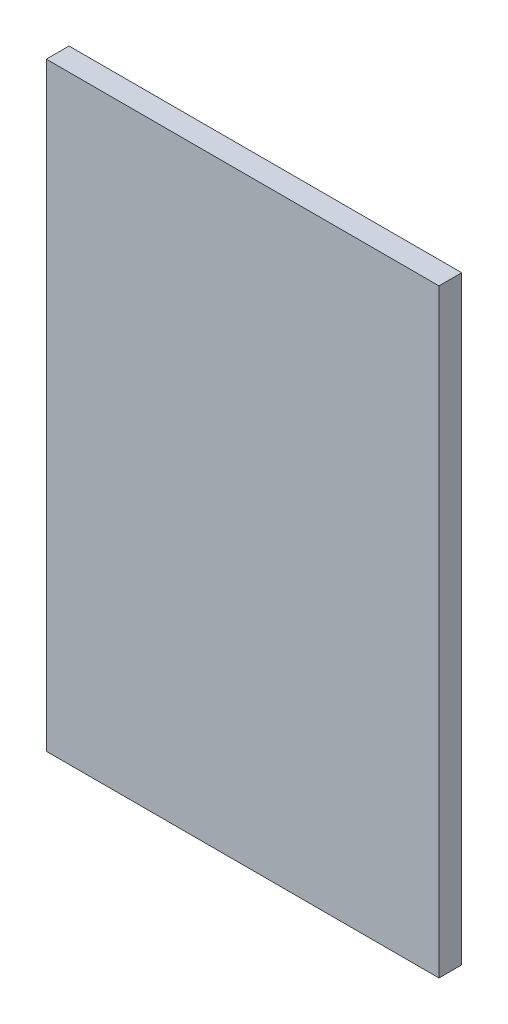
ISO-10303-21;
HEADER;
FILE_DESCRIPTION(('STEP AP214'),'2;1');
FILE_NAME('part.step','',(''),(''),'','','');
FILE_SCHEMA(('AUTOMOTIVE_DESIGN { 1 0 10303 214 1 1 1 1 }'));
ENDSEC;
DATA;
#1=APPLICATION_CONTEXT('core data for automotive mechanical design processes');
#2=APPLICATION_PROTOCOL_DEFINITION('international standard','automotive_design',2000,#1);
#3=PRODUCT_CONTEXT('',#1,'mechanical');
#4=PRODUCT('Part','Part','',(#3));
#5=PRODUCT_RELATED_PRODUCT_CATEGORY('part','',(#4));
#6=PRODUCT_DEFINITION_FORMATION('','',#4);
#7=PRODUCT_DEFINITION_CONTEXT('part definition',#1,'design');
#8=PRODUCT_DEFINITION('design','',#6,#7);
#9=PRODUCT_DEFINITION_SHAPE('','',#8);
#10=(LENGTH_UNIT() NAMED_UNIT(*) SI_UNIT(.MILLI.,.METRE.));
#11=(NAMED_UNIT(*) PLANE_ANGLE_UNIT() SI_UNIT($,.RADIAN.));
#12=(NAMED_UNIT(*) SI_UNIT($,.STERADIAN.) SOLID_ANGLE_UNIT());
#13=UNCERTAINTY_MEASURE_WITH_UNIT(LENGTH_MEASURE(1.E-05),#10,'distance_accuracy_value','');
#14=(GEOMETRIC_REPRESENTATION_CONTEXT(3) GLOBAL_UNCERTAINTY_ASSIGNED_CONTEXT((#13)) GLOBAL_UNIT_ASSIGNED_CONTEXT((#10,
#11,#12)) REPRESENTATION_CONTEXT('',''));
#15=CARTESIAN_POINT('',(0.,0.,0.));
#16=DIRECTION('',(0.,0.,1.));
#17=DIRECTION('',(1.,0.,0.));
#18=AXIS2_PLACEMENT_3D('',#15,#16,#17);
#19=CARTESIAN_POINT('',(11.424993727839,23.624994930231,-0.961480072937));
#20=DIRECTION('',(0.,8.74227765734797E-08,-0.999999999999996));
#21=DIRECTION('',(0.,0.999999999999996,8.74227765734797E-08));
#22=AXIS2_PLACEMENT_3D('',#19,#20,#21);
#23=PLANE('',#22);
#24=DIRECTION('',(1.,-1.19248806384999E-08,0.));
#25=VECTOR('',#24,1.);
#26=CARTESIAN_POINT('',(11.42499374513,25.0749949302312,-0.961479946173999));
#27=LINE('',#26,#25);
#28=CARTESIAN_POINT('',(12.37499374513,25.0749949245669,-0.961479977864737));
#29=VERTEX_POINT('',#28);
#30=CARTESIAN_POINT('',(11.4249937408073,25.0749949302311,-0.961480009555493));
#31=VERTEX_POINT('',#30);
#32=EDGE_CURVE('E76',#29,#31,#27,.F.);
#33=ORIENTED_EDGE('',*,*,#32,.F.);
#34=DIRECTION('',(1.19248806385E-08,1.,0.));
#35=VECTOR('',#34,1.);
#36=CARTESIAN_POINT('',(12.374993727839,23.624994914094,-0.961480072937));
#37=LINE('',#36,#35);
#38=CARTESIAN_POINT('',(12.3749937321617,23.6249949177006,-0.961480072937));
#39=VERTEX_POINT('',#38);
#40=EDGE_CURVE('E58',#39,#29,#37,.T.);
#41=ORIENTED_EDGE('',*,*,#40,.F.);
#42=DIRECTION('',(1.,-1.19248806384999E-08,0.));
#43=VECTOR('',#42,1.);
#44=CARTESIAN_POINT('',(11.424993727839,23.6249949302312,-0.961480072936999));
#45=LINE('',#44,#43);
#46=CARTESIAN_POINT('',(11.424993727839,23.6249949261971,-0.961480072937));
#47=VERTEX_POINT('',#46);
#48=EDGE_CURVE('E20',#39,#47,#45,.F.);
#49=ORIENTED_EDGE('',*,*,#48,.T.);
#50=DIRECTION('',(1.19248806385E-08,1.,0.));
#51=VECTOR('',#50,1.);
#52=CARTESIAN_POINT('',(11.424993727839,23.624994925423,-0.961480072937));
#53=LINE('',#52,#51);
#54=EDGE_CURVE('E55',#47,#31,#53,.T.);
#55=ORIENTED_EDGE('',*,*,#54,.T.);
#56=EDGE_LOOP('',(#33,#41,#49,#55));
#57=FACE_BOUND('',#56,.T.);
#58=ADVANCED_FACE('F17',(#57),#23,.T.);
#59=CARTESIAN_POINT('',(11.424993727839,23.624994925423,-0.906480072937));
#60=DIRECTION('',(1.19248806385E-08,0.999999999999996,8.74227765734797E-08));
#61=DIRECTION('',(0.,-8.74227765734797E-08,0.999999999999996));
#62=AXIS2_PLACEMENT_3D('',#59,#60,#61);
#63=PLANE('',#62);
#64=DIRECTION('',(0.,0.,1.));
#65=VECTOR('',#64,1.);
#66=CARTESIAN_POINT('',(12.374993727839,23.624994914094,-0.906480072937));
#67=LINE('',#66,#65);
#68=CARTESIAN_POINT('',(12.3749937321617,23.6249949140942,-0.906480041246251));
#69=VERTEX_POINT('',#68);
#70=EDGE_CURVE('E78',#69,#39,#67,.F.);
#71=ORIENTED_EDGE('',*,*,#70,.F.);
#72=DIRECTION('',(1.,0.,0.));
#73=VECTOR('',#72,1.);
#74=CARTESIAN_POINT('',(11.424993727839,23.624994914094,-0.906480072937001));
#75=LINE('',#74,#73);
#76=CARTESIAN_POINT('',(11.424993727839,23.6249949225908,-0.90648004124625));
#77=VERTEX_POINT('',#76);
#78=EDGE_CURVE('E73',#69,#77,#75,.F.);
#79=ORIENTED_EDGE('',*,*,#78,.T.);
#80=DIRECTION('',(0.,0.,1.));
#81=VECTOR('',#80,1.);
#82=CARTESIAN_POINT('',(11.424993727839,23.624994925423,-0.906480072937));
#83=LINE('',#82,#81);
#84=EDGE_CURVE('E63',#77,#47,#83,.F.);
#85=ORIENTED_EDGE('',*,*,#84,.T.);
#86=ORIENTED_EDGE('',*,*,#48,.F.);
#87=EDGE_LOOP('',(#71,#79,#85,#86));
#88=FACE_BOUND('',#87,.T.);
#89=ADVANCED_FACE('F72',(#88),#63,.F.);
#90=CARTESIAN_POINT('',(11.424993727839,23.624994925423,-0.906480072937));
#91=DIRECTION('',(1.,-1.19248806385E-08,0.));
#92=DIRECTION('',(1.19248806385E-08,1.,0.));
#93=AXIS2_PLACEMENT_3D('',#90,#91,#92);
#94=PLANE('',#93);
#95=ORIENTED_EDGE('',*,*,#54,.F.);
#96=ORIENTED_EDGE('',*,*,#84,.F.);
#97=DIRECTION('',(0.,0.999999999999996,8.74227765734797E-08));
#98=VECTOR('',#97,1.);
#99=CARTESIAN_POINT('',(11.424993727839,23.624994925423,-0.906480072937));
#100=LINE('',#99,#98);
#101=CARTESIAN_POINT('',(11.4249937408073,25.074994927827,-0.906479946173994));
#102=VERTEX_POINT('',#101);
#103=EDGE_CURVE('E83',#77,#102,#100,.T.);
#104=ORIENTED_EDGE('',*,*,#103,.T.);
#105=DIRECTION('',(0.,-8.74227765734797E-08,0.999999999999996));
#106=VECTOR('',#105,1.);
#107=CARTESIAN_POINT('',(11.42499374513,25.074994925423,-0.906479946174));
#108=LINE('',#107,#106);
#109=EDGE_CURVE('E69',#31,#102,#108,.T.);
#110=ORIENTED_EDGE('',*,*,#109,.F.);
#111=EDGE_LOOP('',(#95,#96,#104,#110));
#112=FACE_BOUND('',#111,.T.);
#113=ADVANCED_FACE('F66',(#112),#94,.F.);
#114=CARTESIAN_POINT('',(11.42499374513,25.074994925423,-0.906479946174));
#115=DIRECTION('',(1.19248806385E-08,0.999999999999996,8.74227765734797E-08));
#116=DIRECTION('',(0.,-8.74227765734797E-08,0.999999999999996));
#117=AXIS2_PLACEMENT_3D('',#114,#115,#116);
#118=PLANE('',#117);
#119=DIRECTION('',(0.,0.,1.));
#120=VECTOR('',#119,1.);
#121=CARTESIAN_POINT('',(12.3749937451301,25.074994918903,-0.906480072937));
#122=LINE('',#121,#120);
#123=CARTESIAN_POINT('',(12.37499374513,25.0749949181287,-0.906479946173994));
#124=VERTEX_POINT('',#123);
#125=EDGE_CURVE('E34',#29,#124,#122,.T.);
#126=ORIENTED_EDGE('',*,*,#125,.F.);
#127=ORIENTED_EDGE('',*,*,#32,.T.);
#128=ORIENTED_EDGE('',*,*,#109,.T.);
#129=DIRECTION('',(1.,0.,0.));
#130=VECTOR('',#129,1.);
#131=CARTESIAN_POINT('',(11.424993727839,25.074994925423,-0.906479946173974));
#132=LINE('',#131,#130);
#133=EDGE_CURVE('E26',#102,#124,#132,.T.);
#134=ORIENTED_EDGE('',*,*,#133,.T.);
#135=EDGE_LOOP('',(#126,#127,#128,#134));
#136=FACE_BOUND('',#135,.T.);
#137=ADVANCED_FACE('F88',(#136),#118,.T.);
#138=CARTESIAN_POINT('',(12.374993727839,23.624994914094,-0.906480072937));
#139=DIRECTION('',(1.,-1.19248806385E-08,0.));
#140=DIRECTION('',(1.19248806385E-08,1.,0.));
#141=AXIS2_PLACEMENT_3D('',#138,#139,#140);
#142=PLANE('',#141);
#143=ORIENTED_EDGE('',*,*,#40,.T.);
#144=ORIENTED_EDGE('',*,*,#125,.T.);
#145=DIRECTION('',(0.,0.999999999999996,8.74227765734797E-08));
#146=VECTOR('',#145,1.);
#147=CARTESIAN_POINT('',(12.37499374513,23.624994925423,-0.906480072937));
#148=LINE('',#147,#146);
#149=EDGE_CURVE('E11',#124,#69,#148,.F.);
#150=ORIENTED_EDGE('',*,*,#149,.T.);
#151=ORIENTED_EDGE('',*,*,#70,.T.);
#152=EDGE_LOOP('',(#143,#144,#150,#151));
#153=FACE_BOUND('',#152,.T.);
#154=ADVANCED_FACE('F91',(#153),#142,.T.);
#155=CARTESIAN_POINT('',(11.424993727839,23.624994925423,-0.906480072937));
#156=DIRECTION('',(0.,8.74227765734797E-08,-0.999999999999996));
#157=DIRECTION('',(0.,0.999999999999996,8.74227765734797E-08));
#158=AXIS2_PLACEMENT_3D('',#155,#156,#157);
#159=PLANE('',#158);
#160=ORIENTED_EDGE('',*,*,#133,.F.);
#161=ORIENTED_EDGE('',*,*,#103,.F.);
#162=ORIENTED_EDGE('',*,*,#78,.F.);
#163=ORIENTED_EDGE('',*,*,#149,.F.);
#164=EDGE_LOOP('',(#160,#161,#162,#163));
#165=FACE_BOUND('',#164,.T.);
#166=ADVANCED_FACE('F90',(#165),#159,.F.);
#167=CLOSED_SHELL('',(#58,#89,#113,#137,#154,#166));
#168=MANIFOLD_SOLID_BREP('B1',#167);
#169=ADVANCED_BREP_SHAPE_REPRESENTATION('',(#18,#168),#14);
#170=SHAPE_DEFINITION_REPRESENTATION(#9,#169);
ENDSEC;
END-ISO-10303-21;
